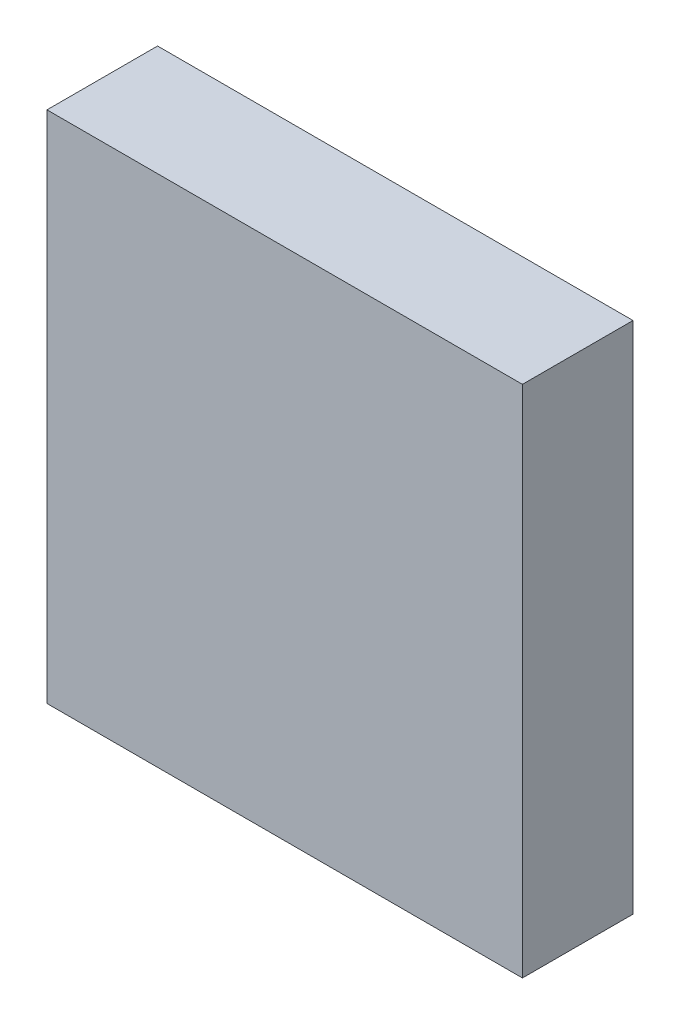
ISO-10303-21;
HEADER;
FILE_DESCRIPTION(('STEP AP214'),'2;1');
FILE_NAME('part.step','',(''),(''),'','','');
FILE_SCHEMA(('AUTOMOTIVE_DESIGN { 1 0 10303 214 1 1 1 1 }'));
ENDSEC;
DATA;
#1=APPLICATION_CONTEXT('core data for automotive mechanical design processes');
#2=APPLICATION_PROTOCOL_DEFINITION('international standard','automotive_design',2000,#1);
#3=PRODUCT_CONTEXT('',#1,'mechanical');
#4=PRODUCT('Part','Part','',(#3));
#5=PRODUCT_RELATED_PRODUCT_CATEGORY('part','',(#4));
#6=PRODUCT_DEFINITION_FORMATION('','',#4);
#7=PRODUCT_DEFINITION_CONTEXT('part definition',#1,'design');
#8=PRODUCT_DEFINITION('design','',#6,#7);
#9=PRODUCT_DEFINITION_SHAPE('','',#8);
#10=(LENGTH_UNIT() NAMED_UNIT(*) SI_UNIT(.MILLI.,.METRE.));
#11=(NAMED_UNIT(*) PLANE_ANGLE_UNIT() SI_UNIT($,.RADIAN.));
#12=(NAMED_UNIT(*) SI_UNIT($,.STERADIAN.) SOLID_ANGLE_UNIT());
#13=UNCERTAINTY_MEASURE_WITH_UNIT(LENGTH_MEASURE(1.E-05),#10,'distance_accuracy_value','');
#14=(GEOMETRIC_REPRESENTATION_CONTEXT(3) GLOBAL_UNCERTAINTY_ASSIGNED_CONTEXT((#13)) GLOBAL_UNIT_ASSIGNED_CONTEXT((#10,
#11,#12)) REPRESENTATION_CONTEXT('',''));
#15=CARTESIAN_POINT('',(0.,0.,0.));
#16=DIRECTION('',(0.,0.,1.));
#17=DIRECTION('',(1.,0.,0.));
#18=AXIS2_PLACEMENT_3D('',#15,#16,#17);
#19=CARTESIAN_POINT('',(215.,232.5,50.));
#20=DIRECTION('',(-1.,0.,0.));
#21=DIRECTION('',(0.,-1.,0.));
#22=AXIS2_PLACEMENT_3D('',#19,#20,#21);
#23=PLANE('',#22);
#24=DIRECTION('',(0.,1.,0.));
#25=VECTOR('',#24,1.);
#26=CARTESIAN_POINT('',(215.,232.5,-50.));
#27=LINE('',#26,#25);
#28=CARTESIAN_POINT('',(215.,-232.5,-50.));
#29=VERTEX_POINT('',#28);
#30=CARTESIAN_POINT('',(215.,232.5,-50.));
#31=VERTEX_POINT('',#30);
#32=EDGE_CURVE('E95',#29,#31,#27,.T.);
#33=ORIENTED_EDGE('',*,*,#32,.T.);
#34=DIRECTION('',(0.,0.,-1.));
#35=VECTOR('',#34,1.);
#36=CARTESIAN_POINT('',(215.,232.5,50.));
#37=LINE('',#36,#35);
#38=CARTESIAN_POINT('',(215.,232.5,50.));
#39=VERTEX_POINT('',#38);
#40=EDGE_CURVE('E11',#39,#31,#37,.T.);
#41=ORIENTED_EDGE('',*,*,#40,.F.);
#42=DIRECTION('',(0.,1.,0.));
#43=VECTOR('',#42,1.);
#44=CARTESIAN_POINT('',(215.,232.5,50.));
#45=LINE('',#44,#43);
#46=CARTESIAN_POINT('',(215.,-232.5,50.));
#47=VERTEX_POINT('',#46);
#48=EDGE_CURVE('E83',#47,#39,#45,.T.);
#49=ORIENTED_EDGE('',*,*,#48,.F.);
#50=DIRECTION('',(0.,0.,-1.));
#51=VECTOR('',#50,1.);
#52=CARTESIAN_POINT('',(215.,-232.5,50.));
#53=LINE('',#52,#51);
#54=EDGE_CURVE('E91',#47,#29,#53,.T.);
#55=ORIENTED_EDGE('',*,*,#54,.T.);
#56=EDGE_LOOP('',(#33,#41,#49,#55));
#57=FACE_BOUND('',#56,.T.);
#58=ADVANCED_FACE('F32',(#57),#23,.F.);
#59=CARTESIAN_POINT('',(-215.,232.5,50.));
#60=DIRECTION('',(0.,-1.,0.));
#61=DIRECTION('',(0.,0.,-1.));
#62=AXIS2_PLACEMENT_3D('',#59,#60,#61);
#63=PLANE('',#62);
#64=DIRECTION('',(-1.,0.,0.));
#65=VECTOR('',#64,1.);
#66=CARTESIAN_POINT('',(-215.,232.5,-50.));
#67=LINE('',#66,#65);
#68=CARTESIAN_POINT('',(-215.,232.5,-50.));
#69=VERTEX_POINT('',#68);
#70=EDGE_CURVE('E87',#31,#69,#67,.T.);
#71=ORIENTED_EDGE('',*,*,#70,.T.);
#72=DIRECTION('',(0.,0.,-1.));
#73=VECTOR('',#72,1.);
#74=CARTESIAN_POINT('',(-215.,232.5,50.));
#75=LINE('',#74,#73);
#76=CARTESIAN_POINT('',(-215.,232.5,50.));
#77=VERTEX_POINT('',#76);
#78=EDGE_CURVE('E40',#77,#69,#75,.T.);
#79=ORIENTED_EDGE('',*,*,#78,.F.);
#80=DIRECTION('',(-1.,0.,0.));
#81=VECTOR('',#80,1.);
#82=CARTESIAN_POINT('',(-215.,232.5,50.));
#83=LINE('',#82,#81);
#84=EDGE_CURVE('E78',#39,#77,#83,.T.);
#85=ORIENTED_EDGE('',*,*,#84,.F.);
#86=ORIENTED_EDGE('',*,*,#40,.T.);
#87=EDGE_LOOP('',(#71,#79,#85,#86));
#88=FACE_BOUND('',#87,.T.);
#89=ADVANCED_FACE('F86',(#88),#63,.F.);
#90=CARTESIAN_POINT('',(-215.,232.5,50.));
#91=DIRECTION('',(1.,0.,0.));
#92=DIRECTION('',(0.,1.,0.));
#93=AXIS2_PLACEMENT_3D('',#90,#91,#92);
#94=PLANE('',#93);
#95=DIRECTION('',(0.,-1.,0.));
#96=VECTOR('',#95,1.);
#97=CARTESIAN_POINT('',(-215.,232.5,-50.));
#98=LINE('',#97,#96);
#99=CARTESIAN_POINT('',(-215.,-232.5,-50.));
#100=VERTEX_POINT('',#99);
#101=EDGE_CURVE('E65',#69,#100,#98,.T.);
#102=ORIENTED_EDGE('',*,*,#101,.T.);
#103=DIRECTION('',(0.,0.,-1.));
#104=VECTOR('',#103,1.);
#105=CARTESIAN_POINT('',(-215.,-232.5,50.));
#106=LINE('',#105,#104);
#107=CARTESIAN_POINT('',(-215.,-232.5,50.));
#108=VERTEX_POINT('',#107);
#109=EDGE_CURVE('E88',#108,#100,#106,.T.);
#110=ORIENTED_EDGE('',*,*,#109,.F.);
#111=DIRECTION('',(0.,-1.,0.));
#112=VECTOR('',#111,1.);
#113=CARTESIAN_POINT('',(-215.,232.5,50.));
#114=LINE('',#113,#112);
#115=EDGE_CURVE('E81',#77,#108,#114,.T.);
#116=ORIENTED_EDGE('',*,*,#115,.F.);
#117=ORIENTED_EDGE('',*,*,#78,.T.);
#118=EDGE_LOOP('',(#102,#110,#116,#117));
#119=FACE_BOUND('',#118,.T.);
#120=ADVANCED_FACE('F89',(#119),#94,.F.);
#121=CARTESIAN_POINT('',(-215.,-232.5,50.));
#122=DIRECTION('',(0.,1.,0.));
#123=DIRECTION('',(0.,0.,1.));
#124=AXIS2_PLACEMENT_3D('',#121,#122,#123);
#125=PLANE('',#124);
#126=DIRECTION('',(1.,0.,0.));
#127=VECTOR('',#126,1.);
#128=CARTESIAN_POINT('',(-215.,-232.5,-50.));
#129=LINE('',#128,#127);
#130=EDGE_CURVE('E71',#100,#29,#129,.T.);
#131=ORIENTED_EDGE('',*,*,#130,.T.);
#132=ORIENTED_EDGE('',*,*,#54,.F.);
#133=DIRECTION('',(1.,0.,0.));
#134=VECTOR('',#133,1.);
#135=CARTESIAN_POINT('',(-215.,-232.5,50.));
#136=LINE('',#135,#134);
#137=EDGE_CURVE('E48',#108,#47,#136,.T.);
#138=ORIENTED_EDGE('',*,*,#137,.F.);
#139=ORIENTED_EDGE('',*,*,#109,.T.);
#140=EDGE_LOOP('',(#131,#132,#138,#139));
#141=FACE_BOUND('',#140,.T.);
#142=ADVANCED_FACE('F102',(#141),#125,.F.);
#143=CARTESIAN_POINT('',(0.,0.,50.));
#144=DIRECTION('',(0.,0.,1.));
#145=DIRECTION('',(1.,0.,0.));
#146=AXIS2_PLACEMENT_3D('',#143,#144,#145);
#147=PLANE('',#146);
#148=ORIENTED_EDGE('',*,*,#48,.T.);
#149=ORIENTED_EDGE('',*,*,#84,.T.);
#150=ORIENTED_EDGE('',*,*,#115,.T.);
#151=ORIENTED_EDGE('',*,*,#137,.T.);
#152=EDGE_LOOP('',(#148,#149,#150,#151));
#153=FACE_BOUND('',#152,.T.);
#154=ADVANCED_FACE('F79',(#153),#147,.T.);
#155=CARTESIAN_POINT('',(0.,0.,-50.));
#156=DIRECTION('',(0.,0.,1.));
#157=DIRECTION('',(1.,0.,0.));
#158=AXIS2_PLACEMENT_3D('',#155,#156,#157);
#159=PLANE('',#158);
#160=ORIENTED_EDGE('',*,*,#32,.F.);
#161=ORIENTED_EDGE('',*,*,#130,.F.);
#162=ORIENTED_EDGE('',*,*,#101,.F.);
#163=ORIENTED_EDGE('',*,*,#70,.F.);
#164=EDGE_LOOP('',(#160,#161,#162,#163));
#165=FACE_BOUND('',#164,.T.);
#166=ADVANCED_FACE('F105',(#165),#159,.F.);
#167=CLOSED_SHELL('',(#58,#89,#120,#142,#154,#166));
#168=MANIFOLD_SOLID_BREP('B2',#167);
#169=ADVANCED_BREP_SHAPE_REPRESENTATION('',(#18,#168),#14);
#170=SHAPE_DEFINITION_REPRESENTATION(#9,#169);
ENDSEC;
END-ISO-10303-21;
